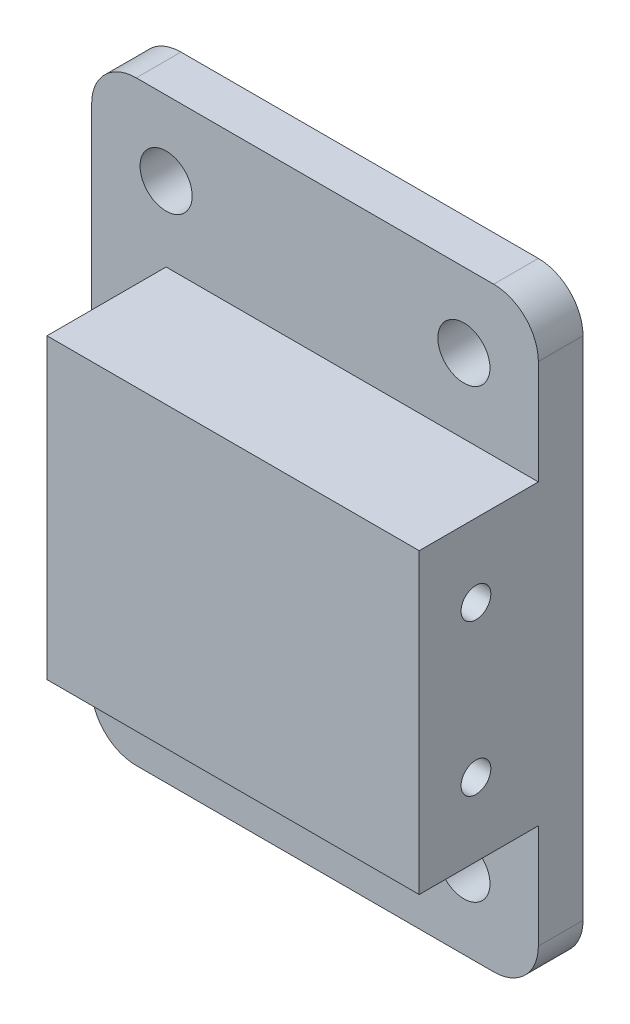
ISO-10303-21;
HEADER;
FILE_DESCRIPTION(('STEP AP214'),'2;1');
FILE_NAME('part.step','',(''),(''),'','','');
FILE_SCHEMA(('AUTOMOTIVE_DESIGN { 1 0 10303 214 1 1 1 1 }'));
ENDSEC;
DATA;
#1=APPLICATION_CONTEXT('core data for automotive mechanical design processes');
#2=APPLICATION_PROTOCOL_DEFINITION('international standard','automotive_design',2000,#1);
#3=PRODUCT_CONTEXT('',#1,'mechanical');
#4=PRODUCT('Part','Part','',(#3));
#5=PRODUCT_RELATED_PRODUCT_CATEGORY('part','',(#4));
#6=PRODUCT_DEFINITION_FORMATION('','',#4);
#7=PRODUCT_DEFINITION_CONTEXT('part definition',#1,'design');
#8=PRODUCT_DEFINITION('design','',#6,#7);
#9=PRODUCT_DEFINITION_SHAPE('','',#8);
#10=(LENGTH_UNIT() NAMED_UNIT(*) SI_UNIT(.MILLI.,.METRE.));
#11=(NAMED_UNIT(*) PLANE_ANGLE_UNIT() SI_UNIT($,.RADIAN.));
#12=(NAMED_UNIT(*) SI_UNIT($,.STERADIAN.) SOLID_ANGLE_UNIT());
#13=UNCERTAINTY_MEASURE_WITH_UNIT(LENGTH_MEASURE(1.E-05),#10,'distance_accuracy_value','');
#14=(GEOMETRIC_REPRESENTATION_CONTEXT(3) GLOBAL_UNCERTAINTY_ASSIGNED_CONTEXT((#13)) GLOBAL_UNIT_ASSIGNED_CONTEXT((#10,
#11,#12)) REPRESENTATION_CONTEXT('',''));
#15=CARTESIAN_POINT('',(0.,0.,0.));
#16=DIRECTION('',(0.,0.,1.));
#17=DIRECTION('',(1.,0.,0.));
#18=AXIS2_PLACEMENT_3D('',#15,#16,#17);
#19=CARTESIAN_POINT('',(0.,0.,1.5));
#20=DIRECTION('',(0.,0.,-1.));
#21=DIRECTION('',(-1.,0.,0.));
#22=AXIS2_PLACEMENT_3D('',#19,#20,#21);
#23=PLANE('',#22);
#24=CARTESIAN_POINT('',(10.,15.,1.5));
#25=DIRECTION('',(0.,0.,1.));
#26=DIRECTION('',(1.,0.,0.));
#27=AXIS2_PLACEMENT_3D('',#24,#25,#26);
#28=CIRCLE('',#27,1.75);
#29=CARTESIAN_POINT('',(11.75,15.,1.5));
#30=VERTEX_POINT('',#29);
#31=EDGE_CURVE('E269',#30,#30,#28,.T.);
#32=ORIENTED_EDGE('',*,*,#31,.F.);
#33=EDGE_LOOP('',(#32));
#34=FACE_BOUND('',#33,.T.);
#35=CARTESIAN_POINT('',(-10.,-15.,1.5));
#36=DIRECTION('',(0.,0.,1.));
#37=DIRECTION('',(1.,0.,0.));
#38=AXIS2_PLACEMENT_3D('',#35,#36,#37);
#39=CIRCLE('',#38,1.75);
#40=CARTESIAN_POINT('',(-8.25,-15.,1.5));
#41=VERTEX_POINT('',#40);
#42=EDGE_CURVE('E263',#41,#41,#39,.T.);
#43=ORIENTED_EDGE('',*,*,#42,.F.);
#44=EDGE_LOOP('',(#43));
#45=FACE_BOUND('',#44,.T.);
#46=CARTESIAN_POINT('',(-10.,15.,1.5));
#47=DIRECTION('',(0.,0.,1.));
#48=DIRECTION('',(1.,0.,0.));
#49=AXIS2_PLACEMENT_3D('',#46,#47,#48);
#50=CIRCLE('',#49,1.75);
#51=CARTESIAN_POINT('',(-8.25,15.,1.5));
#52=VERTEX_POINT('',#51);
#53=EDGE_CURVE('E257',#52,#52,#50,.T.);
#54=ORIENTED_EDGE('',*,*,#53,.F.);
#55=EDGE_LOOP('',(#54));
#56=FACE_BOUND('',#55,.T.);
#57=CARTESIAN_POINT('',(10.,-15.,1.5));
#58=DIRECTION('',(0.,0.,1.));
#59=DIRECTION('',(1.,0.,0.));
#60=AXIS2_PLACEMENT_3D('',#57,#58,#59);
#61=CIRCLE('',#60,1.75);
#62=CARTESIAN_POINT('',(11.75,-15.,1.5));
#63=VERTEX_POINT('',#62);
#64=EDGE_CURVE('E251',#63,#63,#61,.T.);
#65=ORIENTED_EDGE('',*,*,#64,.F.);
#66=EDGE_LOOP('',(#65));
#67=FACE_BOUND('',#66,.T.);
#68=DIRECTION('',(0.,1.,0.));
#69=VECTOR('',#68,1.);
#70=CARTESIAN_POINT('',(15.,-20.,1.5));
#71=LINE('',#70,#69);
#72=CARTESIAN_POINT('',(15.,10.,1.5));
#73=VERTEX_POINT('',#72);
#74=CARTESIAN_POINT('',(15.,17.,1.5));
#75=VERTEX_POINT('',#74);
#76=EDGE_CURVE('E148',#73,#75,#71,.T.);
#77=ORIENTED_EDGE('',*,*,#76,.T.);
#78=CARTESIAN_POINT('',(12.,17.,1.5));
#79=DIRECTION('',(0.,0.,-1.));
#80=DIRECTION('',(-1.,0.,0.));
#81=AXIS2_PLACEMENT_3D('',#78,#79,#80);
#82=CIRCLE('',#81,3.);
#83=CARTESIAN_POINT('',(12.,20.,1.5));
#84=VERTEX_POINT('',#83);
#85=EDGE_CURVE('E196',#75,#84,#82,.F.);
#86=ORIENTED_EDGE('',*,*,#85,.T.);
#87=DIRECTION('',(-1.,0.,0.));
#88=VECTOR('',#87,1.);
#89=CARTESIAN_POINT('',(-15.,20.,1.5));
#90=LINE('',#89,#88);
#91=CARTESIAN_POINT('',(-12.,20.,1.5));
#92=VERTEX_POINT('',#91);
#93=EDGE_CURVE('E159',#84,#92,#90,.T.);
#94=ORIENTED_EDGE('',*,*,#93,.T.);
#95=CARTESIAN_POINT('',(-12.,17.,1.5));
#96=DIRECTION('',(0.,0.,-1.));
#97=DIRECTION('',(-1.,0.,0.));
#98=AXIS2_PLACEMENT_3D('',#95,#96,#97);
#99=CIRCLE('',#98,3.);
#100=CARTESIAN_POINT('',(-15.,17.,1.5));
#101=VERTEX_POINT('',#100);
#102=EDGE_CURVE('E194',#92,#101,#99,.F.);
#103=ORIENTED_EDGE('',*,*,#102,.T.);
#104=DIRECTION('',(0.,-1.,0.));
#105=VECTOR('',#104,1.);
#106=CARTESIAN_POINT('',(-15.,-20.,1.5));
#107=LINE('',#106,#105);
#108=CARTESIAN_POINT('',(-15.,-17.,1.5));
#109=VERTEX_POINT('',#108);
#110=EDGE_CURVE('E162',#101,#109,#107,.T.);
#111=ORIENTED_EDGE('',*,*,#110,.T.);
#112=CARTESIAN_POINT('',(-12.,-17.,1.5));
#113=DIRECTION('',(0.,0.,-1.));
#114=DIRECTION('',(-1.,0.,0.));
#115=AXIS2_PLACEMENT_3D('',#112,#113,#114);
#116=CIRCLE('',#115,3.);
#117=CARTESIAN_POINT('',(-12.,-20.,1.5));
#118=VERTEX_POINT('',#117);
#119=EDGE_CURVE('E53',#109,#118,#116,.F.);
#120=ORIENTED_EDGE('',*,*,#119,.T.);
#121=DIRECTION('',(1.,0.,0.));
#122=VECTOR('',#121,1.);
#123=CARTESIAN_POINT('',(-15.,-20.,1.5));
#124=LINE('',#123,#122);
#125=CARTESIAN_POINT('',(12.,-20.,1.5));
#126=VERTEX_POINT('',#125);
#127=EDGE_CURVE('E164',#118,#126,#124,.T.);
#128=ORIENTED_EDGE('',*,*,#127,.T.);
#129=CARTESIAN_POINT('',(12.,-17.,1.5));
#130=DIRECTION('',(0.,0.,-1.));
#131=DIRECTION('',(-1.,0.,0.));
#132=AXIS2_PLACEMENT_3D('',#129,#130,#131);
#133=CIRCLE('',#132,3.);
#134=CARTESIAN_POINT('',(15.,-17.,1.5));
#135=VERTEX_POINT('',#134);
#136=EDGE_CURVE('E192',#126,#135,#133,.F.);
#137=ORIENTED_EDGE('',*,*,#136,.T.);
#138=CARTESIAN_POINT('',(15.,-10.,1.5));
#139=VERTEX_POINT('',#138);
#140=EDGE_CURVE('E157',#135,#139,#71,.T.);
#141=ORIENTED_EDGE('',*,*,#140,.T.);
#142=DIRECTION('',(1.,0.,0.));
#143=VECTOR('',#142,1.);
#144=CARTESIAN_POINT('',(-10.,-10.,1.5));
#145=LINE('',#144,#143);
#146=CARTESIAN_POINT('',(-10.,-10.,1.5));
#147=VERTEX_POINT('',#146);
#148=EDGE_CURVE('E142',#147,#139,#145,.T.);
#149=ORIENTED_EDGE('',*,*,#148,.F.);
#150=DIRECTION('',(0.,-1.,0.));
#151=VECTOR('',#150,1.);
#152=CARTESIAN_POINT('',(-10.,-10.,1.5));
#153=LINE('',#152,#151);
#154=CARTESIAN_POINT('',(-10.,10.,1.5));
#155=VERTEX_POINT('',#154);
#156=EDGE_CURVE('E225',#155,#147,#153,.T.);
#157=ORIENTED_EDGE('',*,*,#156,.F.);
#158=DIRECTION('',(-1.,0.,0.));
#159=VECTOR('',#158,1.);
#160=CARTESIAN_POINT('',(-10.,10.,1.5));
#161=LINE('',#160,#159);
#162=EDGE_CURVE('E227',#73,#155,#161,.T.);
#163=ORIENTED_EDGE('',*,*,#162,.F.);
#164=EDGE_LOOP('',(#77,#86,#94,#103,#111,#120,#128,#137,#141,#149,#157,#163));
#165=FACE_BOUND('',#164,.T.);
#166=ADVANCED_FACE('F33',(#34,#45,#56,#67,#165),#23,.F.);
#167=CARTESIAN_POINT('',(15.,-20.,1.5));
#168=DIRECTION('',(-1.,0.,0.));
#169=DIRECTION('',(0.,0.,1.));
#170=AXIS2_PLACEMENT_3D('',#167,#168,#169);
#171=PLANE('',#170);
#172=CARTESIAN_POINT('',(15.,5.07999999999999,5.68999999999996));
#173=DIRECTION('',(-1.,0.,0.));
#174=DIRECTION('',(0.,0.,1.));
#175=AXIS2_PLACEMENT_3D('',#172,#173,#174);
#176=CIRCLE('',#175,0.999999999999997);
#177=CARTESIAN_POINT('',(15.,5.07999999999999,6.68999999999995));
#178=VERTEX_POINT('',#177);
#179=EDGE_CURVE('E240',#178,#178,#176,.T.);
#180=ORIENTED_EDGE('',*,*,#179,.T.);
#181=EDGE_LOOP('',(#180));
#182=FACE_BOUND('',#181,.T.);
#183=CARTESIAN_POINT('',(15.,-5.07999999999999,5.68999999999996));
#184=DIRECTION('',(-1.,0.,0.));
#185=DIRECTION('',(0.,0.,1.));
#186=AXIS2_PLACEMENT_3D('',#183,#184,#185);
#187=CIRCLE('',#186,0.999999999999997);
#188=CARTESIAN_POINT('',(15.,-5.07999999999999,6.68999999999995));
#189=VERTEX_POINT('',#188);
#190=EDGE_CURVE('E233',#189,#189,#187,.T.);
#191=ORIENTED_EDGE('',*,*,#190,.T.);
#192=EDGE_LOOP('',(#191));
#193=FACE_BOUND('',#192,.T.);
#194=DIRECTION('',(0.,1.,0.));
#195=VECTOR('',#194,1.);
#196=CARTESIAN_POINT('',(15.,-20.,-1.5));
#197=LINE('',#196,#195);
#198=CARTESIAN_POINT('',(15.,-17.,-1.5));
#199=VERTEX_POINT('',#198);
#200=CARTESIAN_POINT('',(15.,17.,-1.5));
#201=VERTEX_POINT('',#200);
#202=EDGE_CURVE('E149',#199,#201,#197,.T.);
#203=ORIENTED_EDGE('',*,*,#202,.T.);
#204=DIRECTION('',(0.,0.,-1.));
#205=VECTOR('',#204,1.);
#206=CARTESIAN_POINT('',(15.,17.,1.5));
#207=LINE('',#206,#205);
#208=EDGE_CURVE('E189',#201,#75,#207,.F.);
#209=ORIENTED_EDGE('',*,*,#208,.T.);
#210=ORIENTED_EDGE('',*,*,#76,.F.);
#211=DIRECTION('',(0.,0.,-1.));
#212=VECTOR('',#211,1.);
#213=CARTESIAN_POINT('',(15.,10.,9.5));
#214=LINE('',#213,#212);
#215=CARTESIAN_POINT('',(15.,10.,9.5));
#216=VERTEX_POINT('',#215);
#217=EDGE_CURVE('E127',#216,#73,#214,.T.);
#218=ORIENTED_EDGE('',*,*,#217,.F.);
#219=DIRECTION('',(0.,1.,0.));
#220=VECTOR('',#219,1.);
#221=CARTESIAN_POINT('',(15.,-10.,9.5));
#222=LINE('',#221,#220);
#223=CARTESIAN_POINT('',(15.,-10.,9.5));
#224=VERTEX_POINT('',#223);
#225=EDGE_CURVE('E133',#224,#216,#222,.T.);
#226=ORIENTED_EDGE('',*,*,#225,.F.);
#227=DIRECTION('',(0.,0.,-1.));
#228=VECTOR('',#227,1.);
#229=CARTESIAN_POINT('',(15.,-10.,9.5));
#230=LINE('',#229,#228);
#231=EDGE_CURVE('E218',#224,#139,#230,.T.);
#232=ORIENTED_EDGE('',*,*,#231,.T.);
#233=ORIENTED_EDGE('',*,*,#140,.F.);
#234=DIRECTION('',(0.,0.,-1.));
#235=VECTOR('',#234,1.);
#236=CARTESIAN_POINT('',(15.,-17.,1.5));
#237=LINE('',#236,#235);
#238=EDGE_CURVE('E186',#135,#199,#237,.T.);
#239=ORIENTED_EDGE('',*,*,#238,.T.);
#240=EDGE_LOOP('',(#203,#209,#210,#218,#226,#232,#233,#239));
#241=FACE_BOUND('',#240,.T.);
#242=ADVANCED_FACE('F146',(#182,#193,#241),#171,.F.);
#243=CARTESIAN_POINT('',(-15.,20.,1.5));
#244=DIRECTION('',(0.,-1.,0.));
#245=DIRECTION('',(0.,0.,-1.));
#246=AXIS2_PLACEMENT_3D('',#243,#244,#245);
#247=PLANE('',#246);
#248=ORIENTED_EDGE('',*,*,#93,.F.);
#249=DIRECTION('',(0.,0.,-1.));
#250=VECTOR('',#249,1.);
#251=CARTESIAN_POINT('',(12.,20.,1.5));
#252=LINE('',#251,#250);
#253=CARTESIAN_POINT('',(12.,20.,-1.5));
#254=VERTEX_POINT('',#253);
#255=EDGE_CURVE('E175',#84,#254,#252,.T.);
#256=ORIENTED_EDGE('',*,*,#255,.T.);
#257=DIRECTION('',(-1.,0.,0.));
#258=VECTOR('',#257,1.);
#259=CARTESIAN_POINT('',(-15.,20.,-1.5));
#260=LINE('',#259,#258);
#261=CARTESIAN_POINT('',(-12.,20.,-1.5));
#262=VERTEX_POINT('',#261);
#263=EDGE_CURVE('E151',#254,#262,#260,.T.);
#264=ORIENTED_EDGE('',*,*,#263,.T.);
#265=DIRECTION('',(0.,0.,-1.));
#266=VECTOR('',#265,1.);
#267=CARTESIAN_POINT('',(-12.,20.,1.5));
#268=LINE('',#267,#266);
#269=EDGE_CURVE('E165',#262,#92,#268,.F.);
#270=ORIENTED_EDGE('',*,*,#269,.T.);
#271=EDGE_LOOP('',(#248,#256,#264,#270));
#272=FACE_BOUND('',#271,.T.);
#273=ADVANCED_FACE('F324',(#272),#247,.F.);
#274=CARTESIAN_POINT('',(-15.,-20.,1.5));
#275=DIRECTION('',(1.,0.,0.));
#276=DIRECTION('',(0.,0.,-1.));
#277=AXIS2_PLACEMENT_3D('',#274,#275,#276);
#278=PLANE('',#277);
#279=ORIENTED_EDGE('',*,*,#110,.F.);
#280=DIRECTION('',(0.,0.,-1.));
#281=VECTOR('',#280,1.);
#282=CARTESIAN_POINT('',(-15.,17.,1.5));
#283=LINE('',#282,#281);
#284=CARTESIAN_POINT('',(-15.,17.,-1.5));
#285=VERTEX_POINT('',#284);
#286=EDGE_CURVE('E200',#101,#285,#283,.T.);
#287=ORIENTED_EDGE('',*,*,#286,.T.);
#288=DIRECTION('',(0.,-1.,0.));
#289=VECTOR('',#288,1.);
#290=CARTESIAN_POINT('',(-15.,-20.,-1.5));
#291=LINE('',#290,#289);
#292=CARTESIAN_POINT('',(-15.,-17.,-1.5));
#293=VERTEX_POINT('',#292);
#294=EDGE_CURVE('E169',#285,#293,#291,.T.);
#295=ORIENTED_EDGE('',*,*,#294,.T.);
#296=DIRECTION('',(0.,0.,-1.));
#297=VECTOR('',#296,1.);
#298=CARTESIAN_POINT('',(-15.,-17.,1.5));
#299=LINE('',#298,#297);
#300=EDGE_CURVE('E198',#293,#109,#299,.F.);
#301=ORIENTED_EDGE('',*,*,#300,.T.);
#302=EDGE_LOOP('',(#279,#287,#295,#301));
#303=FACE_BOUND('',#302,.T.);
#304=ADVANCED_FACE('F321',(#303),#278,.F.);
#305=CARTESIAN_POINT('',(-15.,-20.,1.5));
#306=DIRECTION('',(0.,1.,0.));
#307=DIRECTION('',(0.,0.,1.));
#308=AXIS2_PLACEMENT_3D('',#305,#306,#307);
#309=PLANE('',#308);
#310=DIRECTION('',(1.,0.,0.));
#311=VECTOR('',#310,1.);
#312=CARTESIAN_POINT('',(-15.,-20.,-1.5));
#313=LINE('',#312,#311);
#314=CARTESIAN_POINT('',(-12.,-20.,-1.5));
#315=VERTEX_POINT('',#314);
#316=CARTESIAN_POINT('',(12.,-20.,-1.5));
#317=VERTEX_POINT('',#316);
#318=EDGE_CURVE('E172',#315,#317,#313,.T.);
#319=ORIENTED_EDGE('',*,*,#318,.T.);
#320=DIRECTION('',(0.,0.,-1.));
#321=VECTOR('',#320,1.);
#322=CARTESIAN_POINT('',(12.,-20.,1.5));
#323=LINE('',#322,#321);
#324=EDGE_CURVE('E11',#317,#126,#323,.F.);
#325=ORIENTED_EDGE('',*,*,#324,.T.);
#326=ORIENTED_EDGE('',*,*,#127,.F.);
#327=DIRECTION('',(0.,0.,-1.));
#328=VECTOR('',#327,1.);
#329=CARTESIAN_POINT('',(-12.,-20.,1.5));
#330=LINE('',#329,#328);
#331=EDGE_CURVE('E41',#118,#315,#330,.T.);
#332=ORIENTED_EDGE('',*,*,#331,.T.);
#333=EDGE_LOOP('',(#319,#325,#326,#332));
#334=FACE_BOUND('',#333,.T.);
#335=ADVANCED_FACE('F205',(#334),#309,.F.);
#336=CARTESIAN_POINT('',(0.,0.,-1.5));
#337=DIRECTION('',(0.,0.,-1.));
#338=DIRECTION('',(-1.,0.,0.));
#339=AXIS2_PLACEMENT_3D('',#336,#337,#338);
#340=PLANE('',#339);
#341=CARTESIAN_POINT('',(10.,15.,-1.5));
#342=DIRECTION('',(0.,0.,1.));
#343=DIRECTION('',(1.,0.,0.));
#344=AXIS2_PLACEMENT_3D('',#341,#342,#343);
#345=CIRCLE('',#344,1.75);
#346=CARTESIAN_POINT('',(11.75,15.,-1.5));
#347=VERTEX_POINT('',#346);
#348=EDGE_CURVE('E266',#347,#347,#345,.T.);
#349=ORIENTED_EDGE('',*,*,#348,.T.);
#350=EDGE_LOOP('',(#349));
#351=FACE_BOUND('',#350,.T.);
#352=CARTESIAN_POINT('',(-10.,-15.,-1.5));
#353=DIRECTION('',(0.,0.,1.));
#354=DIRECTION('',(1.,0.,0.));
#355=AXIS2_PLACEMENT_3D('',#352,#353,#354);
#356=CIRCLE('',#355,1.75);
#357=CARTESIAN_POINT('',(-8.25,-15.,-1.5));
#358=VERTEX_POINT('',#357);
#359=EDGE_CURVE('E260',#358,#358,#356,.T.);
#360=ORIENTED_EDGE('',*,*,#359,.T.);
#361=EDGE_LOOP('',(#360));
#362=FACE_BOUND('',#361,.T.);
#363=CARTESIAN_POINT('',(-10.,15.,-1.5));
#364=DIRECTION('',(0.,0.,1.));
#365=DIRECTION('',(1.,0.,0.));
#366=AXIS2_PLACEMENT_3D('',#363,#364,#365);
#367=CIRCLE('',#366,1.75);
#368=CARTESIAN_POINT('',(-8.25,15.,-1.5));
#369=VERTEX_POINT('',#368);
#370=EDGE_CURVE('E254',#369,#369,#367,.T.);
#371=ORIENTED_EDGE('',*,*,#370,.T.);
#372=EDGE_LOOP('',(#371));
#373=FACE_BOUND('',#372,.T.);
#374=CARTESIAN_POINT('',(10.,-15.,-1.5));
#375=DIRECTION('',(0.,0.,1.));
#376=DIRECTION('',(1.,0.,0.));
#377=AXIS2_PLACEMENT_3D('',#374,#375,#376);
#378=CIRCLE('',#377,1.75);
#379=CARTESIAN_POINT('',(11.75,-15.,-1.5));
#380=VERTEX_POINT('',#379);
#381=EDGE_CURVE('E248',#380,#380,#378,.T.);
#382=ORIENTED_EDGE('',*,*,#381,.T.);
#383=EDGE_LOOP('',(#382));
#384=FACE_BOUND('',#383,.T.);
#385=ORIENTED_EDGE('',*,*,#263,.F.);
#386=CARTESIAN_POINT('',(12.,17.,-1.5));
#387=DIRECTION('',(0.,0.,-1.));
#388=DIRECTION('',(-1.,0.,0.));
#389=AXIS2_PLACEMENT_3D('',#386,#387,#388);
#390=CIRCLE('',#389,3.);
#391=EDGE_CURVE('E184',#254,#201,#390,.T.);
#392=ORIENTED_EDGE('',*,*,#391,.T.);
#393=ORIENTED_EDGE('',*,*,#202,.F.);
#394=CARTESIAN_POINT('',(12.,-17.,-1.5));
#395=DIRECTION('',(0.,0.,-1.));
#396=DIRECTION('',(-1.,0.,0.));
#397=AXIS2_PLACEMENT_3D('',#394,#395,#396);
#398=CIRCLE('',#397,3.);
#399=EDGE_CURVE('E180',#199,#317,#398,.T.);
#400=ORIENTED_EDGE('',*,*,#399,.T.);
#401=ORIENTED_EDGE('',*,*,#318,.F.);
#402=CARTESIAN_POINT('',(-12.,-17.,-1.5));
#403=DIRECTION('',(0.,0.,-1.));
#404=DIRECTION('',(-1.,0.,0.));
#405=AXIS2_PLACEMENT_3D('',#402,#403,#404);
#406=CIRCLE('',#405,3.);
#407=EDGE_CURVE('E178',#315,#293,#406,.T.);
#408=ORIENTED_EDGE('',*,*,#407,.T.);
#409=ORIENTED_EDGE('',*,*,#294,.F.);
#410=CARTESIAN_POINT('',(-12.,17.,-1.5));
#411=DIRECTION('',(0.,0.,-1.));
#412=DIRECTION('',(-1.,0.,0.));
#413=AXIS2_PLACEMENT_3D('',#410,#411,#412);
#414=CIRCLE('',#413,3.);
#415=EDGE_CURVE('E182',#285,#262,#414,.T.);
#416=ORIENTED_EDGE('',*,*,#415,.T.);
#417=EDGE_LOOP('',(#385,#392,#393,#400,#401,#408,#409,#416));
#418=FACE_BOUND('',#417,.T.);
#419=ADVANCED_FACE('F209',(#351,#362,#373,#384,#418),#340,.T.);
#420=CARTESIAN_POINT('',(-10.,10.,9.5));
#421=DIRECTION('',(0.,-1.,0.));
#422=DIRECTION('',(0.,0.,-1.));
#423=AXIS2_PLACEMENT_3D('',#420,#421,#422);
#424=PLANE('',#423);
#425=ORIENTED_EDGE('',*,*,#162,.T.);
#426=DIRECTION('',(0.,0.,-1.));
#427=VECTOR('',#426,1.);
#428=CARTESIAN_POINT('',(-10.,10.,9.5));
#429=LINE('',#428,#427);
#430=CARTESIAN_POINT('',(-10.,10.,9.5));
#431=VERTEX_POINT('',#430);
#432=EDGE_CURVE('E129',#431,#155,#429,.T.);
#433=ORIENTED_EDGE('',*,*,#432,.F.);
#434=DIRECTION('',(-1.,0.,0.));
#435=VECTOR('',#434,1.);
#436=CARTESIAN_POINT('',(-10.,10.,9.5));
#437=LINE('',#436,#435);
#438=EDGE_CURVE('E122',#216,#431,#437,.T.);
#439=ORIENTED_EDGE('',*,*,#438,.F.);
#440=ORIENTED_EDGE('',*,*,#217,.T.);
#441=EDGE_LOOP('',(#425,#433,#439,#440));
#442=FACE_BOUND('',#441,.T.);
#443=ADVANCED_FACE('F125',(#442),#424,.F.);
#444=CARTESIAN_POINT('',(-10.,-10.,9.5));
#445=DIRECTION('',(1.,0.,0.));
#446=DIRECTION('',(0.,0.,-1.));
#447=AXIS2_PLACEMENT_3D('',#444,#445,#446);
#448=PLANE('',#447);
#449=CARTESIAN_POINT('',(-10.,5.07999999999999,5.68999999999996));
#450=DIRECTION('',(-1.,0.,0.));
#451=DIRECTION('',(0.,0.,1.));
#452=AXIS2_PLACEMENT_3D('',#449,#450,#451);
#453=CIRCLE('',#452,0.999999999999999);
#454=CARTESIAN_POINT('',(-10.,5.07999999999999,6.68999999999996));
#455=VERTEX_POINT('',#454);
#456=EDGE_CURVE('E245',#455,#455,#453,.T.);
#457=ORIENTED_EDGE('',*,*,#456,.F.);
#458=EDGE_LOOP('',(#457));
#459=FACE_BOUND('',#458,.T.);
#460=CARTESIAN_POINT('',(-10.,-5.07999999999999,5.68999999999996));
#461=DIRECTION('',(-1.,0.,0.));
#462=DIRECTION('',(0.,0.,1.));
#463=AXIS2_PLACEMENT_3D('',#460,#461,#462);
#464=CIRCLE('',#463,0.999999999999999);
#465=CARTESIAN_POINT('',(-10.,-5.07999999999999,6.68999999999996));
#466=VERTEX_POINT('',#465);
#467=EDGE_CURVE('E235',#466,#466,#464,.T.);
#468=ORIENTED_EDGE('',*,*,#467,.F.);
#469=EDGE_LOOP('',(#468));
#470=FACE_BOUND('',#469,.T.);
#471=ORIENTED_EDGE('',*,*,#156,.T.);
#472=DIRECTION('',(0.,0.,-1.));
#473=VECTOR('',#472,1.);
#474=CARTESIAN_POINT('',(-10.,-10.,9.5));
#475=LINE('',#474,#473);
#476=CARTESIAN_POINT('',(-10.,-10.,9.5));
#477=VERTEX_POINT('',#476);
#478=EDGE_CURVE('E153',#477,#147,#475,.T.);
#479=ORIENTED_EDGE('',*,*,#478,.F.);
#480=DIRECTION('',(0.,-1.,0.));
#481=VECTOR('',#480,1.);
#482=CARTESIAN_POINT('',(-10.,-10.,9.5));
#483=LINE('',#482,#481);
#484=EDGE_CURVE('E132',#431,#477,#483,.T.);
#485=ORIENTED_EDGE('',*,*,#484,.F.);
#486=ORIENTED_EDGE('',*,*,#432,.T.);
#487=EDGE_LOOP('',(#471,#479,#485,#486));
#488=FACE_BOUND('',#487,.T.);
#489=ADVANCED_FACE('F310',(#459,#470,#488),#448,.F.);
#490=CARTESIAN_POINT('',(-10.,-10.,9.5));
#491=DIRECTION('',(0.,1.,0.));
#492=DIRECTION('',(0.,0.,1.));
#493=AXIS2_PLACEMENT_3D('',#490,#491,#492);
#494=PLANE('',#493);
#495=ORIENTED_EDGE('',*,*,#148,.T.);
#496=ORIENTED_EDGE('',*,*,#231,.F.);
#497=DIRECTION('',(1.,0.,0.));
#498=VECTOR('',#497,1.);
#499=CARTESIAN_POINT('',(-10.,-10.,9.5));
#500=LINE('',#499,#498);
#501=EDGE_CURVE('E138',#477,#224,#500,.T.);
#502=ORIENTED_EDGE('',*,*,#501,.F.);
#503=ORIENTED_EDGE('',*,*,#478,.T.);
#504=EDGE_LOOP('',(#495,#496,#502,#503));
#505=FACE_BOUND('',#504,.T.);
#506=ADVANCED_FACE('F223',(#505),#494,.F.);
#507=CARTESIAN_POINT('',(0.,0.,9.5));
#508=DIRECTION('',(0.,0.,-1.));
#509=DIRECTION('',(-1.,0.,0.));
#510=AXIS2_PLACEMENT_3D('',#507,#508,#509);
#511=PLANE('',#510);
#512=ORIENTED_EDGE('',*,*,#225,.T.);
#513=ORIENTED_EDGE('',*,*,#438,.T.);
#514=ORIENTED_EDGE('',*,*,#484,.T.);
#515=ORIENTED_EDGE('',*,*,#501,.T.);
#516=EDGE_LOOP('',(#512,#513,#514,#515));
#517=FACE_BOUND('',#516,.T.);
#518=ADVANCED_FACE('F136',(#517),#511,.F.);
#519=CARTESIAN_POINT('',(-10.,-5.07999999999999,5.68999999999996));
#520=DIRECTION('',(-1.,0.,0.));
#521=DIRECTION('',(0.,0.,1.));
#522=AXIS2_PLACEMENT_3D('',#519,#520,#521);
#523=CYLINDRICAL_SURFACE('',#522,0.999999999999998);
#524=ORIENTED_EDGE('',*,*,#190,.F.);
#525=EDGE_LOOP('',(#524));
#526=FACE_BOUND('',#525,.T.);
#527=ORIENTED_EDGE('',*,*,#467,.T.);
#528=EDGE_LOOP('',(#527));
#529=FACE_BOUND('',#528,.T.);
#530=ADVANCED_FACE('F297',(#526,#529),#523,.F.);
#531=CARTESIAN_POINT('',(-10.,5.07999999999999,5.68999999999996));
#532=DIRECTION('',(-1.,0.,0.));
#533=DIRECTION('',(0.,0.,1.));
#534=AXIS2_PLACEMENT_3D('',#531,#532,#533);
#535=CYLINDRICAL_SURFACE('',#534,0.999999999999998);
#536=ORIENTED_EDGE('',*,*,#179,.F.);
#537=EDGE_LOOP('',(#536));
#538=FACE_BOUND('',#537,.T.);
#539=ORIENTED_EDGE('',*,*,#456,.T.);
#540=EDGE_LOOP('',(#539));
#541=FACE_BOUND('',#540,.T.);
#542=ADVANCED_FACE('F287',(#538,#541),#535,.F.);
#543=CARTESIAN_POINT('',(10.,-15.,1.5));
#544=DIRECTION('',(0.,0.,1.));
#545=DIRECTION('',(1.,0.,0.));
#546=AXIS2_PLACEMENT_3D('',#543,#544,#545);
#547=CYLINDRICAL_SURFACE('',#546,1.75);
#548=ORIENTED_EDGE('',*,*,#381,.F.);
#549=EDGE_LOOP('',(#548));
#550=FACE_BOUND('',#549,.T.);
#551=ORIENTED_EDGE('',*,*,#64,.T.);
#552=EDGE_LOOP('',(#551));
#553=FACE_BOUND('',#552,.T.);
#554=ADVANCED_FACE('F284',(#550,#553),#547,.F.);
#555=CARTESIAN_POINT('',(-10.,15.,1.5));
#556=DIRECTION('',(0.,0.,1.));
#557=DIRECTION('',(1.,0.,0.));
#558=AXIS2_PLACEMENT_3D('',#555,#556,#557);
#559=CYLINDRICAL_SURFACE('',#558,1.75);
#560=ORIENTED_EDGE('',*,*,#370,.F.);
#561=EDGE_LOOP('',(#560));
#562=FACE_BOUND('',#561,.T.);
#563=ORIENTED_EDGE('',*,*,#53,.T.);
#564=EDGE_LOOP('',(#563));
#565=FACE_BOUND('',#564,.T.);
#566=ADVANCED_FACE('F286',(#562,#565),#559,.F.);
#567=CARTESIAN_POINT('',(-10.,-15.,1.5));
#568=DIRECTION('',(0.,0.,1.));
#569=DIRECTION('',(1.,0.,0.));
#570=AXIS2_PLACEMENT_3D('',#567,#568,#569);
#571=CYLINDRICAL_SURFACE('',#570,1.75);
#572=ORIENTED_EDGE('',*,*,#359,.F.);
#573=EDGE_LOOP('',(#572));
#574=FACE_BOUND('',#573,.T.);
#575=ORIENTED_EDGE('',*,*,#42,.T.);
#576=EDGE_LOOP('',(#575));
#577=FACE_BOUND('',#576,.T.);
#578=ADVANCED_FACE('F294',(#574,#577),#571,.F.);
#579=CARTESIAN_POINT('',(10.,15.,1.5));
#580=DIRECTION('',(0.,0.,1.));
#581=DIRECTION('',(1.,0.,0.));
#582=AXIS2_PLACEMENT_3D('',#579,#580,#581);
#583=CYLINDRICAL_SURFACE('',#582,1.75);
#584=ORIENTED_EDGE('',*,*,#348,.F.);
#585=EDGE_LOOP('',(#584));
#586=FACE_BOUND('',#585,.T.);
#587=ORIENTED_EDGE('',*,*,#31,.T.);
#588=EDGE_LOOP('',(#587));
#589=FACE_BOUND('',#588,.T.);
#590=ADVANCED_FACE('F273',(#586,#589),#583,.F.);
#591=CARTESIAN_POINT('',(12.,17.,1.5));
#592=DIRECTION('',(0.,0.,-1.));
#593=DIRECTION('',(-1.,0.,0.));
#594=AXIS2_PLACEMENT_3D('',#591,#592,#593);
#595=CYLINDRICAL_SURFACE('',#594,3.);
#596=ORIENTED_EDGE('',*,*,#85,.F.);
#597=ORIENTED_EDGE('',*,*,#208,.F.);
#598=ORIENTED_EDGE('',*,*,#391,.F.);
#599=ORIENTED_EDGE('',*,*,#255,.F.);
#600=EDGE_LOOP('',(#596,#597,#598,#599));
#601=FACE_BOUND('',#600,.T.);
#602=ADVANCED_FACE('F332',(#601),#595,.T.);
#603=CARTESIAN_POINT('',(-12.,17.,1.5));
#604=DIRECTION('',(0.,0.,-1.));
#605=DIRECTION('',(-1.,0.,0.));
#606=AXIS2_PLACEMENT_3D('',#603,#604,#605);
#607=CYLINDRICAL_SURFACE('',#606,3.);
#608=ORIENTED_EDGE('',*,*,#102,.F.);
#609=ORIENTED_EDGE('',*,*,#269,.F.);
#610=ORIENTED_EDGE('',*,*,#415,.F.);
#611=ORIENTED_EDGE('',*,*,#286,.F.);
#612=EDGE_LOOP('',(#608,#609,#610,#611));
#613=FACE_BOUND('',#612,.T.);
#614=ADVANCED_FACE('F335',(#613),#607,.T.);
#615=CARTESIAN_POINT('',(12.,-17.,1.5));
#616=DIRECTION('',(0.,0.,-1.));
#617=DIRECTION('',(-1.,0.,0.));
#618=AXIS2_PLACEMENT_3D('',#615,#616,#617);
#619=CYLINDRICAL_SURFACE('',#618,3.);
#620=ORIENTED_EDGE('',*,*,#136,.F.);
#621=ORIENTED_EDGE('',*,*,#324,.F.);
#622=ORIENTED_EDGE('',*,*,#399,.F.);
#623=ORIENTED_EDGE('',*,*,#238,.F.);
#624=EDGE_LOOP('',(#620,#621,#622,#623));
#625=FACE_BOUND('',#624,.T.);
#626=ADVANCED_FACE('F215',(#625),#619,.T.);
#627=CARTESIAN_POINT('',(-12.,-17.,1.5));
#628=DIRECTION('',(0.,0.,-1.));
#629=DIRECTION('',(-1.,0.,0.));
#630=AXIS2_PLACEMENT_3D('',#627,#628,#629);
#631=CYLINDRICAL_SURFACE('',#630,3.);
#632=ORIENTED_EDGE('',*,*,#119,.F.);
#633=ORIENTED_EDGE('',*,*,#300,.F.);
#634=ORIENTED_EDGE('',*,*,#407,.F.);
#635=ORIENTED_EDGE('',*,*,#331,.F.);
#636=EDGE_LOOP('',(#632,#633,#634,#635));
#637=FACE_BOUND('',#636,.T.);
#638=ADVANCED_FACE('F35',(#637),#631,.T.);
#639=CLOSED_SHELL('',(#166,#242,#273,#304,#335,#419,#443,#489,#506,#518,#530,#542,#554,#566,
#578,#590,#602,#614,#626,#638));
#640=MANIFOLD_SOLID_BREP('B2',#639);
#641=ADVANCED_BREP_SHAPE_REPRESENTATION('',(#18,#640),#14);
#642=SHAPE_DEFINITION_REPRESENTATION(#9,#641);
ENDSEC;
END-ISO-10303-21;
